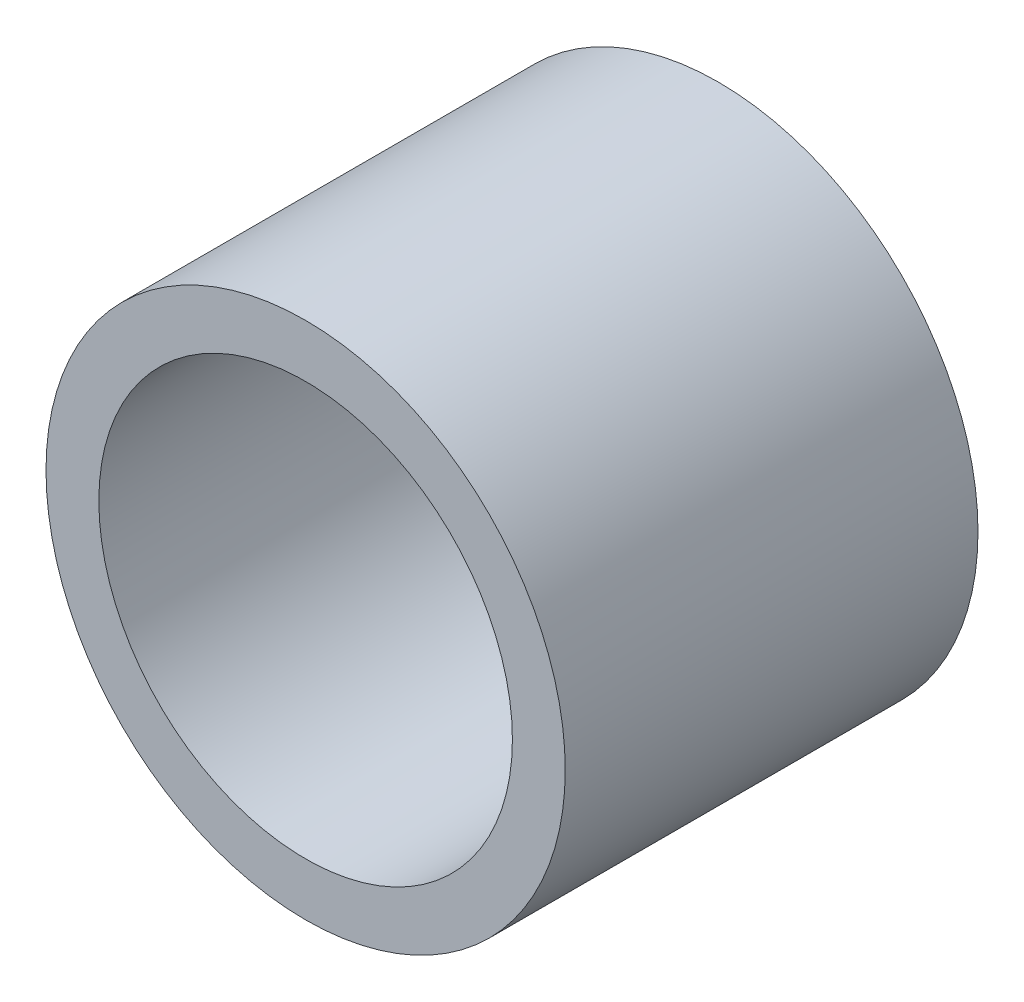
ISO-10303-21;
HEADER;
FILE_DESCRIPTION(('STEP AP214'),'2;1');
FILE_NAME('part.step','',(''),(''),'','','');
FILE_SCHEMA(('AUTOMOTIVE_DESIGN { 1 0 10303 214 1 1 1 1 }'));
ENDSEC;
DATA;
#1=APPLICATION_CONTEXT('core data for automotive mechanical design processes');
#2=APPLICATION_PROTOCOL_DEFINITION('international standard','automotive_design',2000,#1);
#3=PRODUCT_CONTEXT('',#1,'mechanical');
#4=PRODUCT('Part','Part','',(#3));
#5=PRODUCT_RELATED_PRODUCT_CATEGORY('part','',(#4));
#6=PRODUCT_DEFINITION_FORMATION('','',#4);
#7=PRODUCT_DEFINITION_CONTEXT('part definition',#1,'design');
#8=PRODUCT_DEFINITION('design','',#6,#7);
#9=PRODUCT_DEFINITION_SHAPE('','',#8);
#10=(LENGTH_UNIT() NAMED_UNIT(*) SI_UNIT(.MILLI.,.METRE.));
#11=(NAMED_UNIT(*) PLANE_ANGLE_UNIT() SI_UNIT($,.RADIAN.));
#12=(NAMED_UNIT(*) SI_UNIT($,.STERADIAN.) SOLID_ANGLE_UNIT());
#13=UNCERTAINTY_MEASURE_WITH_UNIT(LENGTH_MEASURE(1.E-05),#10,'distance_accuracy_value','');
#14=(GEOMETRIC_REPRESENTATION_CONTEXT(3) GLOBAL_UNCERTAINTY_ASSIGNED_CONTEXT((#13)) GLOBAL_UNIT_ASSIGNED_CONTEXT((#10,
#11,#12)) REPRESENTATION_CONTEXT('',''));
#15=CARTESIAN_POINT('',(0.,0.,0.));
#16=DIRECTION('',(0.,0.,1.));
#17=DIRECTION('',(1.,0.,0.));
#18=AXIS2_PLACEMENT_3D('',#15,#16,#17);
#19=CARTESIAN_POINT('',(0.,0.,3.175));
#20=DIRECTION('',(0.,0.,1.));
#21=DIRECTION('',(1.,0.,0.));
#22=AXIS2_PLACEMENT_3D('',#19,#20,#21);
#23=PLANE('',#22);
#24=CARTESIAN_POINT('',(0.,0.,3.175));
#25=DIRECTION('',(0.,0.,1.));
#26=DIRECTION('',(1.,0.,0.));
#27=AXIS2_PLACEMENT_3D('',#24,#25,#26);
#28=CIRCLE('',#27,3.99415);
#29=CARTESIAN_POINT('',(3.99415,0.,3.175));
#30=VERTEX_POINT('',#29);
#31=EDGE_CURVE('E10',#30,#30,#28,.T.);
#32=ORIENTED_EDGE('',*,*,#31,.T.);
#33=EDGE_LOOP('',(#32));
#34=FACE_BOUND('',#33,.T.);
#35=CARTESIAN_POINT('',(0.,0.,3.175));
#36=DIRECTION('',(0.,0.,1.));
#37=DIRECTION('',(1.,0.,0.));
#38=AXIS2_PLACEMENT_3D('',#35,#36,#37);
#39=CIRCLE('',#38,3.18135);
#40=CARTESIAN_POINT('',(3.18135,0.,3.175));
#41=VERTEX_POINT('',#40);
#42=EDGE_CURVE('E50',#41,#41,#39,.T.);
#43=ORIENTED_EDGE('',*,*,#42,.F.);
#44=EDGE_LOOP('',(#43));
#45=FACE_BOUND('',#44,.T.);
#46=ADVANCED_FACE('F39',(#34,#45),#23,.T.);
#47=CARTESIAN_POINT('',(0.,0.,3.175));
#48=DIRECTION('',(0.,0.,-1.));
#49=DIRECTION('',(-1.,0.,0.));
#50=AXIS2_PLACEMENT_3D('',#47,#48,#49);
#51=CYLINDRICAL_SURFACE('',#50,3.99415);
#52=ORIENTED_EDGE('',*,*,#31,.F.);
#53=EDGE_LOOP('',(#52));
#54=FACE_BOUND('',#53,.T.);
#55=CARTESIAN_POINT('',(0.,0.,-3.175));
#56=DIRECTION('',(0.,0.,1.));
#57=DIRECTION('',(1.,0.,0.));
#58=AXIS2_PLACEMENT_3D('',#55,#56,#57);
#59=CIRCLE('',#58,3.99415);
#60=CARTESIAN_POINT('',(3.99415,0.,-3.175));
#61=VERTEX_POINT('',#60);
#62=EDGE_CURVE('E52',#61,#61,#59,.T.);
#63=ORIENTED_EDGE('',*,*,#62,.T.);
#64=EDGE_LOOP('',(#63));
#65=FACE_BOUND('',#64,.T.);
#66=ADVANCED_FACE('F41',(#54,#65),#51,.T.);
#67=CARTESIAN_POINT('',(0.,0.,3.175));
#68=DIRECTION('',(0.,0.,-1.));
#69=DIRECTION('',(-1.,0.,0.));
#70=AXIS2_PLACEMENT_3D('',#67,#68,#69);
#71=CYLINDRICAL_SURFACE('',#70,3.18135);
#72=ORIENTED_EDGE('',*,*,#42,.T.);
#73=EDGE_LOOP('',(#72));
#74=FACE_BOUND('',#73,.T.);
#75=CARTESIAN_POINT('',(0.,0.,-3.175));
#76=DIRECTION('',(0.,0.,1.));
#77=DIRECTION('',(1.,0.,0.));
#78=AXIS2_PLACEMENT_3D('',#75,#76,#77);
#79=CIRCLE('',#78,3.18135);
#80=CARTESIAN_POINT('',(3.18135,0.,-3.175));
#81=VERTEX_POINT('',#80);
#82=EDGE_CURVE('E56',#81,#81,#79,.T.);
#83=ORIENTED_EDGE('',*,*,#82,.F.);
#84=EDGE_LOOP('',(#83));
#85=FACE_BOUND('',#84,.T.);
#86=ADVANCED_FACE('F68',(#74,#85),#71,.F.);
#87=CARTESIAN_POINT('',(0.,0.,-3.175));
#88=DIRECTION('',(0.,0.,1.));
#89=DIRECTION('',(1.,0.,0.));
#90=AXIS2_PLACEMENT_3D('',#87,#88,#89);
#91=PLANE('',#90);
#92=ORIENTED_EDGE('',*,*,#82,.T.);
#93=EDGE_LOOP('',(#92));
#94=FACE_BOUND('',#93,.T.);
#95=ORIENTED_EDGE('',*,*,#62,.F.);
#96=EDGE_LOOP('',(#95));
#97=FACE_BOUND('',#96,.T.);
#98=ADVANCED_FACE('F70',(#94,#97),#91,.F.);
#99=CLOSED_SHELL('',(#46,#66,#86,#98));
#100=MANIFOLD_SOLID_BREP('B2',#99);
#101=ADVANCED_BREP_SHAPE_REPRESENTATION('',(#18,#100),#14);
#102=SHAPE_DEFINITION_REPRESENTATION(#9,#101);
ENDSEC;
END-ISO-10303-21;
